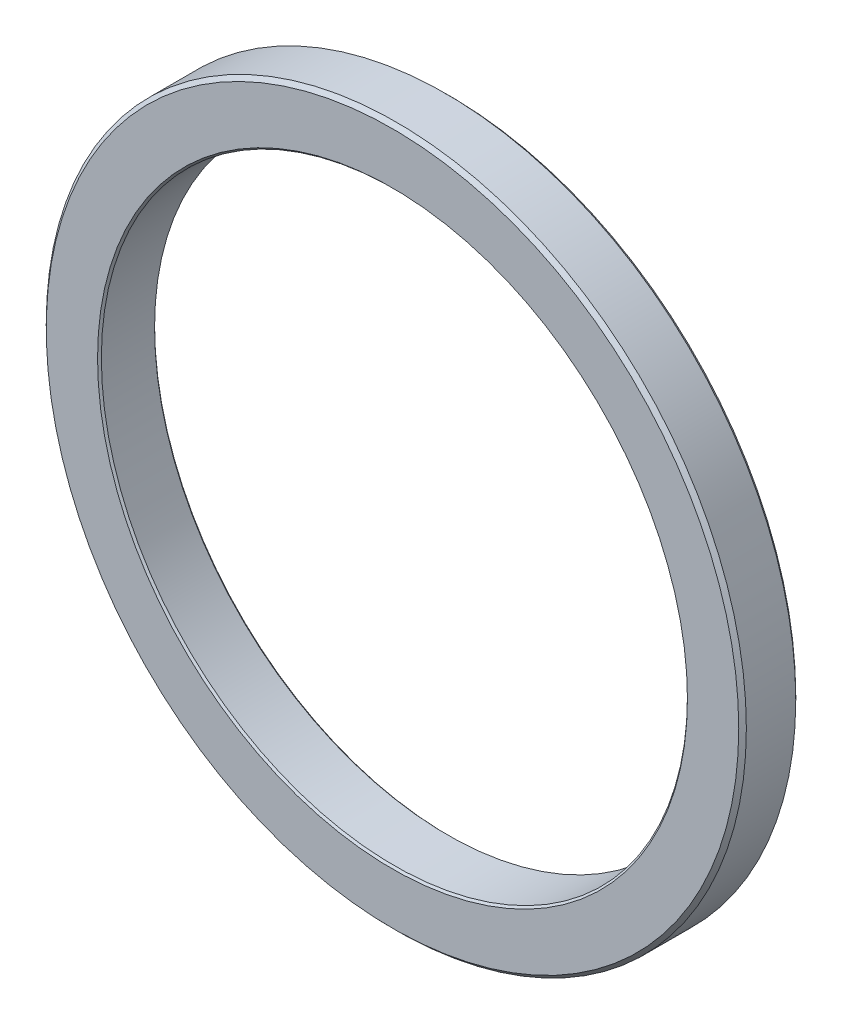
ISO-10303-21;
HEADER;
FILE_DESCRIPTION(('STEP AP214'),'2;1');
FILE_NAME('part.step','',(''),(''),'','','');
FILE_SCHEMA(('AUTOMOTIVE_DESIGN { 1 0 10303 214 1 1 1 1 }'));
ENDSEC;
DATA;
#1=APPLICATION_CONTEXT('core data for automotive mechanical design processes');
#2=APPLICATION_PROTOCOL_DEFINITION('international standard','automotive_design',2000,#1);
#3=PRODUCT_CONTEXT('',#1,'mechanical');
#4=PRODUCT('Part','Part','',(#3));
#5=PRODUCT_RELATED_PRODUCT_CATEGORY('part','',(#4));
#6=PRODUCT_DEFINITION_FORMATION('','',#4);
#7=PRODUCT_DEFINITION_CONTEXT('part definition',#1,'design');
#8=PRODUCT_DEFINITION('design','',#6,#7);
#9=PRODUCT_DEFINITION_SHAPE('','',#8);
#10=(LENGTH_UNIT() NAMED_UNIT(*) SI_UNIT(.MILLI.,.METRE.));
#11=(NAMED_UNIT(*) PLANE_ANGLE_UNIT() SI_UNIT($,.RADIAN.));
#12=(NAMED_UNIT(*) SI_UNIT($,.STERADIAN.) SOLID_ANGLE_UNIT());
#13=UNCERTAINTY_MEASURE_WITH_UNIT(LENGTH_MEASURE(1.E-05),#10,'distance_accuracy_value','');
#14=(GEOMETRIC_REPRESENTATION_CONTEXT(3) GLOBAL_UNCERTAINTY_ASSIGNED_CONTEXT((#13)) GLOBAL_UNIT_ASSIGNED_CONTEXT((#10,
#11,#12)) REPRESENTATION_CONTEXT('',''));
#15=CARTESIAN_POINT('',(0.,0.,0.));
#16=DIRECTION('',(0.,0.,1.));
#17=DIRECTION('',(1.,0.,0.));
#18=AXIS2_PLACEMENT_3D('',#15,#16,#17);
#19=CARTESIAN_POINT('',(0.,45.55,0.));
#20=DIRECTION('',(0.,0.,-1.));
#21=DIRECTION('',(-1.,0.,0.));
#22=AXIS2_PLACEMENT_3D('',#19,#20,#21);
#23=PLANE('',#22);
#24=CARTESIAN_POINT('',(0.,0.,0.));
#25=DIRECTION('',(0.,0.,1.));
#26=DIRECTION('',(1.,0.,0.));
#27=AXIS2_PLACEMENT_3D('',#24,#25,#26);
#28=CIRCLE('',#27,38.8);
#29=CARTESIAN_POINT('',(38.8,0.,0.));
#30=VERTEX_POINT('',#29);
#31=EDGE_CURVE('E10',#30,#30,#28,.T.);
#32=ORIENTED_EDGE('',*,*,#31,.F.);
#33=EDGE_LOOP('',(#32));
#34=FACE_BOUND('',#33,.T.);
#35=CARTESIAN_POINT('',(0.,0.,0.));
#36=DIRECTION('',(0.,0.,1.));
#37=DIRECTION('',(1.,0.,0.));
#38=AXIS2_PLACEMENT_3D('',#35,#36,#37);
#39=CIRCLE('',#38,45.55);
#40=CARTESIAN_POINT('',(45.55,0.,0.));
#41=VERTEX_POINT('',#40);
#42=EDGE_CURVE('E67',#41,#41,#39,.T.);
#43=ORIENTED_EDGE('',*,*,#42,.T.);
#44=EDGE_LOOP('',(#43));
#45=FACE_BOUND('',#44,.T.);
#46=ADVANCED_FACE('F39',(#34,#45),#23,.F.);
#47=CARTESIAN_POINT('',(0.,0.,0.));
#48=DIRECTION('',(0.,0.,1.));
#49=DIRECTION('',(1.,0.,0.));
#50=AXIS2_PLACEMENT_3D('',#47,#48,#49);
#51=CONICAL_SURFACE('',#50,38.8,0.785398163397449);
#52=CARTESIAN_POINT('',(0.,0.,-0.250000000000001));
#53=DIRECTION('',(0.,0.,1.));
#54=DIRECTION('',(1.,0.,0.));
#55=AXIS2_PLACEMENT_3D('',#52,#53,#54);
#56=CIRCLE('',#55,38.55);
#57=CARTESIAN_POINT('',(38.55,0.,-0.250000000000001));
#58=VERTEX_POINT('',#57);
#59=EDGE_CURVE('E45',#58,#58,#56,.T.);
#60=ORIENTED_EDGE('',*,*,#59,.F.);
#61=EDGE_LOOP('',(#60));
#62=FACE_BOUND('',#61,.T.);
#63=ORIENTED_EDGE('',*,*,#31,.T.);
#64=EDGE_LOOP('',(#63));
#65=FACE_BOUND('',#64,.T.);
#66=ADVANCED_FACE('F104',(#62,#65),#51,.F.);
#67=CARTESIAN_POINT('',(0.,0.,0.));
#68=DIRECTION('',(0.,0.,1.));
#69=DIRECTION('',(1.,0.,0.));
#70=AXIS2_PLACEMENT_3D('',#67,#68,#69);
#71=CYLINDRICAL_SURFACE('',#70,38.55);
#72=CARTESIAN_POINT('',(0.,0.,-7.25));
#73=DIRECTION('',(0.,0.,1.));
#74=DIRECTION('',(1.,0.,0.));
#75=AXIS2_PLACEMENT_3D('',#72,#73,#74);
#76=CIRCLE('',#75,38.55);
#77=CARTESIAN_POINT('',(38.55,0.,-7.25));
#78=VERTEX_POINT('',#77);
#79=EDGE_CURVE('E49',#78,#78,#76,.T.);
#80=ORIENTED_EDGE('',*,*,#79,.F.);
#81=EDGE_LOOP('',(#80));
#82=FACE_BOUND('',#81,.T.);
#83=ORIENTED_EDGE('',*,*,#59,.T.);
#84=EDGE_LOOP('',(#83));
#85=FACE_BOUND('',#84,.T.);
#86=ADVANCED_FACE('F99',(#82,#85),#71,.F.);
#87=CARTESIAN_POINT('',(0.,0.,-7.25));
#88=DIRECTION('',(0.,0.,-1.));
#89=DIRECTION('',(-1.,0.,0.));
#90=AXIS2_PLACEMENT_3D('',#87,#88,#89);
#91=CONICAL_SURFACE('',#90,38.55,0.785398163397448);
#92=CARTESIAN_POINT('',(0.,0.,-7.5));
#93=DIRECTION('',(0.,0.,1.));
#94=DIRECTION('',(1.,0.,0.));
#95=AXIS2_PLACEMENT_3D('',#92,#93,#94);
#96=CIRCLE('',#95,38.8);
#97=CARTESIAN_POINT('',(38.8,0.,-7.5));
#98=VERTEX_POINT('',#97);
#99=EDGE_CURVE('E53',#98,#98,#96,.T.);
#100=ORIENTED_EDGE('',*,*,#99,.F.);
#101=EDGE_LOOP('',(#100));
#102=FACE_BOUND('',#101,.T.);
#103=ORIENTED_EDGE('',*,*,#79,.T.);
#104=EDGE_LOOP('',(#103));
#105=FACE_BOUND('',#104,.T.);
#106=ADVANCED_FACE('F93',(#102,#105),#91,.F.);
#107=CARTESIAN_POINT('',(0.,45.55,-7.5));
#108=DIRECTION('',(0.,0.,1.));
#109=DIRECTION('',(1.,0.,0.));
#110=AXIS2_PLACEMENT_3D('',#107,#108,#109);
#111=PLANE('',#110);
#112=CARTESIAN_POINT('',(0.,0.,-7.5));
#113=DIRECTION('',(0.,0.,1.));
#114=DIRECTION('',(1.,0.,0.));
#115=AXIS2_PLACEMENT_3D('',#112,#113,#114);
#116=CIRCLE('',#115,45.55);
#117=CARTESIAN_POINT('',(45.55,0.,-7.5));
#118=VERTEX_POINT('',#117);
#119=EDGE_CURVE('E58',#118,#118,#116,.T.);
#120=ORIENTED_EDGE('',*,*,#119,.F.);
#121=EDGE_LOOP('',(#120));
#122=FACE_BOUND('',#121,.T.);
#123=ORIENTED_EDGE('',*,*,#99,.T.);
#124=EDGE_LOOP('',(#123));
#125=FACE_BOUND('',#124,.T.);
#126=ADVANCED_FACE('F87',(#122,#125),#111,.F.);
#127=CARTESIAN_POINT('',(0.,0.,-7.5));
#128=DIRECTION('',(0.,0.,1.));
#129=DIRECTION('',(1.,0.,0.));
#130=AXIS2_PLACEMENT_3D('',#127,#128,#129);
#131=CONICAL_SURFACE('',#130,45.55,0.785398163397448);
#132=CARTESIAN_POINT('',(0.,0.,-7.));
#133=DIRECTION('',(0.,0.,1.));
#134=DIRECTION('',(1.,0.,0.));
#135=AXIS2_PLACEMENT_3D('',#132,#133,#134);
#136=CIRCLE('',#135,46.05);
#137=CARTESIAN_POINT('',(46.05,0.,-7.));
#138=VERTEX_POINT('',#137);
#139=EDGE_CURVE('E61',#138,#138,#136,.T.);
#140=ORIENTED_EDGE('',*,*,#139,.F.);
#141=EDGE_LOOP('',(#140));
#142=FACE_BOUND('',#141,.T.);
#143=ORIENTED_EDGE('',*,*,#119,.T.);
#144=EDGE_LOOP('',(#143));
#145=FACE_BOUND('',#144,.T.);
#146=ADVANCED_FACE('F81',(#142,#145),#131,.T.);
#147=CARTESIAN_POINT('',(0.,0.,0.));
#148=DIRECTION('',(0.,0.,1.));
#149=DIRECTION('',(1.,0.,0.));
#150=AXIS2_PLACEMENT_3D('',#147,#148,#149);
#151=CYLINDRICAL_SURFACE('',#150,46.05);
#152=CARTESIAN_POINT('',(0.,0.,-0.5));
#153=DIRECTION('',(0.,0.,1.));
#154=DIRECTION('',(1.,0.,0.));
#155=AXIS2_PLACEMENT_3D('',#152,#153,#154);
#156=CIRCLE('',#155,46.05);
#157=CARTESIAN_POINT('',(46.05,0.,-0.5));
#158=VERTEX_POINT('',#157);
#159=EDGE_CURVE('E64',#158,#158,#156,.T.);
#160=ORIENTED_EDGE('',*,*,#159,.F.);
#161=EDGE_LOOP('',(#160));
#162=FACE_BOUND('',#161,.T.);
#163=ORIENTED_EDGE('',*,*,#139,.T.);
#164=EDGE_LOOP('',(#163));
#165=FACE_BOUND('',#164,.T.);
#166=ADVANCED_FACE('F75',(#162,#165),#151,.T.);
#167=CARTESIAN_POINT('',(0.,0.,-0.5));
#168=DIRECTION('',(0.,0.,-1.));
#169=DIRECTION('',(-1.,0.,0.));
#170=AXIS2_PLACEMENT_3D('',#167,#168,#169);
#171=CONICAL_SURFACE('',#170,46.05,0.785398163397449);
#172=ORIENTED_EDGE('',*,*,#42,.F.);
#173=EDGE_LOOP('',(#172));
#174=FACE_BOUND('',#173,.T.);
#175=ORIENTED_EDGE('',*,*,#159,.T.);
#176=EDGE_LOOP('',(#175));
#177=FACE_BOUND('',#176,.T.);
#178=ADVANCED_FACE('F72',(#174,#177),#171,.T.);
#179=CLOSED_SHELL('',(#46,#66,#86,#106,#126,#146,#166,#178));
#180=MANIFOLD_SOLID_BREP('B2',#179);
#181=ADVANCED_BREP_SHAPE_REPRESENTATION('',(#18,#180),#14);
#182=SHAPE_DEFINITION_REPRESENTATION(#9,#181);
ENDSEC;
END-ISO-10303-21;
